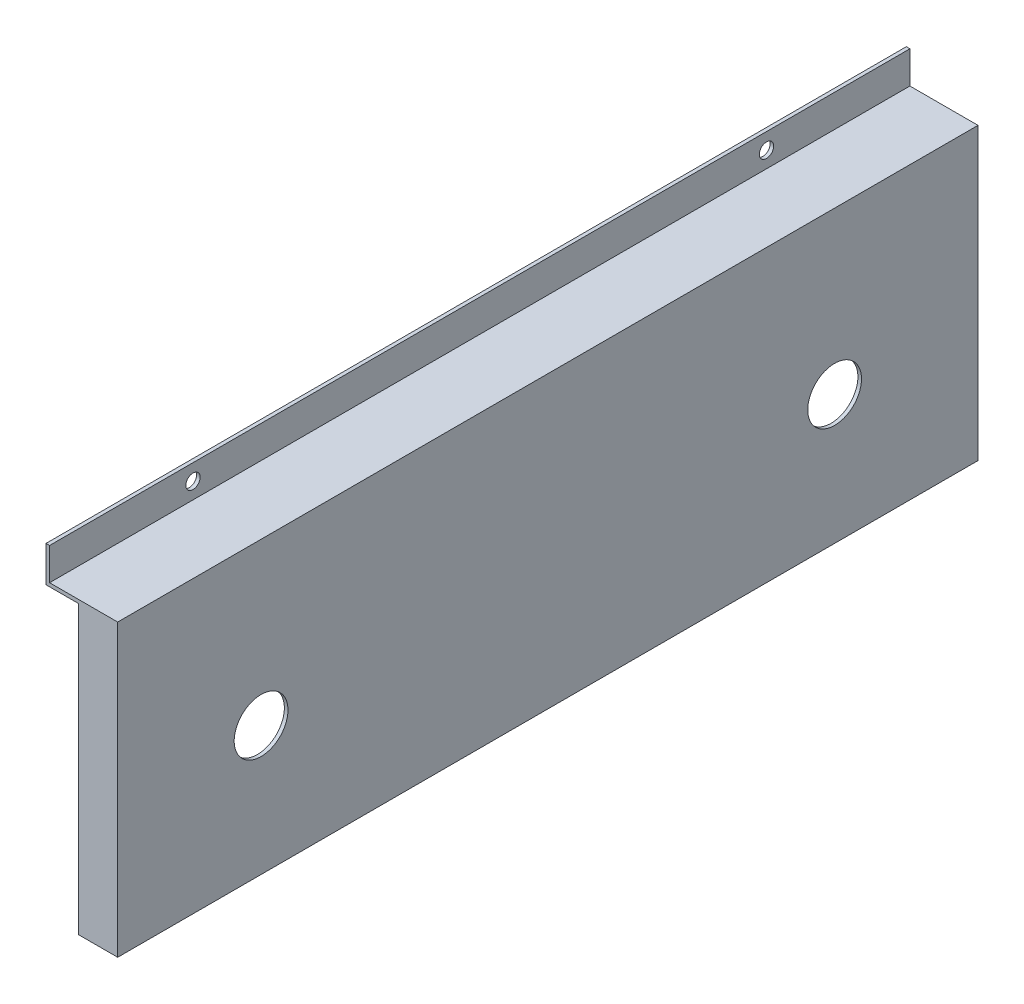
ISO-10303-21;
HEADER;
FILE_DESCRIPTION(('STEP AP214'),'2;1');
FILE_NAME('part.step','',(''),(''),'','','');
FILE_SCHEMA(('AUTOMOTIVE_DESIGN { 1 0 10303 214 1 1 1 1 }'));
ENDSEC;
DATA;
#1=APPLICATION_CONTEXT('core data for automotive mechanical design processes');
#2=APPLICATION_PROTOCOL_DEFINITION('international standard','automotive_design',2000,#1);
#3=PRODUCT_CONTEXT('',#1,'mechanical');
#4=PRODUCT('Part','Part','',(#3));
#5=PRODUCT_RELATED_PRODUCT_CATEGORY('part','',(#4));
#6=PRODUCT_DEFINITION_FORMATION('','',#4);
#7=PRODUCT_DEFINITION_CONTEXT('part definition',#1,'design');
#8=PRODUCT_DEFINITION('design','',#6,#7);
#9=PRODUCT_DEFINITION_SHAPE('','',#8);
#10=(LENGTH_UNIT() NAMED_UNIT(*) SI_UNIT(.MILLI.,.METRE.));
#11=(NAMED_UNIT(*) PLANE_ANGLE_UNIT() SI_UNIT($,.RADIAN.));
#12=(NAMED_UNIT(*) SI_UNIT($,.STERADIAN.) SOLID_ANGLE_UNIT());
#13=UNCERTAINTY_MEASURE_WITH_UNIT(LENGTH_MEASURE(1.E-05),#10,'distance_accuracy_value','');
#14=(GEOMETRIC_REPRESENTATION_CONTEXT(3) GLOBAL_UNCERTAINTY_ASSIGNED_CONTEXT((#13)) GLOBAL_UNIT_ASSIGNED_CONTEXT((#10,
#11,#12)) REPRESENTATION_CONTEXT('',''));
#15=CARTESIAN_POINT('',(0.,0.,0.));
#16=DIRECTION('',(0.,0.,1.));
#17=DIRECTION('',(1.,0.,0.));
#18=AXIS2_PLACEMENT_3D('',#15,#16,#17);
#19=CARTESIAN_POINT('',(16.3306469468303,-76.1973985270025,239.));
#20=DIRECTION('',(0.,0.,1.));
#21=DIRECTION('',(1.,0.,0.));
#22=AXIS2_PLACEMENT_3D('',#19,#20,#21);
#23=PLANE('',#22);
#24=DIRECTION('',(0.,1.,0.));
#25=VECTOR('',#24,1.);
#26=CARTESIAN_POINT('',(16.3306469468303,-76.1973985270025,239.));
#27=LINE('',#26,#25);
#28=CARTESIAN_POINT('',(16.3306469468303,-66.1973985270025,239.));
#29=VERTEX_POINT('',#28);
#30=CARTESIAN_POINT('',(16.3306469468303,13.8026014729975,239.));
#31=VERTEX_POINT('',#30);
#32=EDGE_CURVE('E208',#29,#31,#27,.T.);
#33=ORIENTED_EDGE('',*,*,#32,.F.);
#34=DIRECTION('',(-1.,0.,0.));
#35=VECTOR('',#34,1.);
#36=CARTESIAN_POINT('',(16.3306469468303,-66.1973985270025,239.));
#37=LINE('',#36,#35);
#38=CARTESIAN_POINT('',(6.33064694683027,-66.1973985270025,239.));
#39=VERTEX_POINT('',#38);
#40=EDGE_CURVE('E256',#29,#39,#37,.T.);
#41=ORIENTED_EDGE('',*,*,#40,.T.);
#42=DIRECTION('',(0.,-1.,0.));
#43=VECTOR('',#42,1.);
#44=CARTESIAN_POINT('',(6.33064694683027,13.8026014729975,239.));
#45=LINE('',#44,#43);
#46=CARTESIAN_POINT('',(6.33064694683027,13.8026014729975,239.));
#47=VERTEX_POINT('',#46);
#48=EDGE_CURVE('E167',#47,#39,#45,.T.);
#49=ORIENTED_EDGE('',*,*,#48,.F.);
#50=DIRECTION('',(-1.,0.,0.));
#51=VECTOR('',#50,1.);
#52=CARTESIAN_POINT('',(16.3306469468303,13.8026014729975,239.));
#53=LINE('',#52,#51);
#54=EDGE_CURVE('E213',#31,#47,#53,.T.);
#55=ORIENTED_EDGE('',*,*,#54,.F.);
#56=EDGE_LOOP('',(#33,#41,#49,#55));
#57=FACE_BOUND('',#56,.T.);
#58=ADVANCED_FACE('F33',(#57),#23,.F.);
#59=CARTESIAN_POINT('',(-2.66935305316973,23.8026014729975,240.));
#60=DIRECTION('',(1.,0.,0.));
#61=DIRECTION('',(0.,0.,-1.));
#62=AXIS2_PLACEMENT_3D('',#59,#60,#61);
#63=PLANE('',#62);
#64=CARTESIAN_POINT('',(-2.66935305316973,19.3026014729975,200.));
#65=DIRECTION('',(-1.,0.,0.));
#66=DIRECTION('',(0.,0.,1.));
#67=AXIS2_PLACEMENT_3D('',#64,#65,#66);
#68=CIRCLE('',#67,2.);
#69=CARTESIAN_POINT('',(-2.66935305316973,19.3026014729975,202.));
#70=VERTEX_POINT('',#69);
#71=EDGE_CURVE('E164',#70,#70,#68,.T.);
#72=ORIENTED_EDGE('',*,*,#71,.F.);
#73=EDGE_LOOP('',(#72));
#74=FACE_BOUND('',#73,.T.);
#75=CARTESIAN_POINT('',(-2.66935305316973,19.3026014729975,40.));
#76=DIRECTION('',(-1.,0.,0.));
#77=DIRECTION('',(0.,0.,1.));
#78=AXIS2_PLACEMENT_3D('',#75,#76,#77);
#79=CIRCLE('',#78,2.);
#80=CARTESIAN_POINT('',(-2.66935305316973,19.3026014729975,42.));
#81=VERTEX_POINT('',#80);
#82=EDGE_CURVE('E160',#81,#81,#79,.T.);
#83=ORIENTED_EDGE('',*,*,#82,.F.);
#84=EDGE_LOOP('',(#83));
#85=FACE_BOUND('',#84,.T.);
#86=DIRECTION('',(0.,0.,-1.));
#87=VECTOR('',#86,1.);
#88=CARTESIAN_POINT('',(-2.66935305316973,13.8026014729975,1.));
#89=LINE('',#88,#87);
#90=CARTESIAN_POINT('',(-2.66935305316973,13.8026014729975,240.));
#91=VERTEX_POINT('',#90);
#92=CARTESIAN_POINT('',(-2.66935305316973,13.8026014729975,0.));
#93=VERTEX_POINT('',#92);
#94=EDGE_CURVE('E159',#91,#93,#89,.T.);
#95=ORIENTED_EDGE('',*,*,#94,.F.);
#96=DIRECTION('',(0.,-1.,0.));
#97=VECTOR('',#96,1.);
#98=CARTESIAN_POINT('',(-2.66935305316973,23.8026014729975,240.));
#99=LINE('',#98,#97);
#100=CARTESIAN_POINT('',(-2.66935305316973,23.8026014729975,240.));
#101=VERTEX_POINT('',#100);
#102=EDGE_CURVE('E147',#101,#91,#99,.T.);
#103=ORIENTED_EDGE('',*,*,#102,.F.);
#104=DIRECTION('',(0.,0.,-1.));
#105=VECTOR('',#104,1.);
#106=CARTESIAN_POINT('',(-2.66935305316973,23.8026014729975,240.));
#107=LINE('',#106,#105);
#108=CARTESIAN_POINT('',(-2.66935305316973,23.8026014729975,0.));
#109=VERTEX_POINT('',#108);
#110=EDGE_CURVE('E41',#101,#109,#107,.T.);
#111=ORIENTED_EDGE('',*,*,#110,.T.);
#112=DIRECTION('',(0.,-1.,0.));
#113=VECTOR('',#112,1.);
#114=CARTESIAN_POINT('',(-2.66935305316973,23.8026014729975,0.));
#115=LINE('',#114,#113);
#116=EDGE_CURVE('E145',#109,#93,#115,.T.);
#117=ORIENTED_EDGE('',*,*,#116,.T.);
#118=EDGE_LOOP('',(#95,#103,#111,#117));
#119=FACE_BOUND('',#118,.T.);
#120=ADVANCED_FACE('F35',(#74,#85,#119),#63,.F.);
#121=CARTESIAN_POINT('',(17.3306469468303,23.8026014729975,240.));
#122=DIRECTION('',(-1.,0.,0.));
#123=DIRECTION('',(0.,-1.,0.));
#124=AXIS2_PLACEMENT_3D('',#121,#122,#123);
#125=PLANE('',#124);
#126=CARTESIAN_POINT('',(17.3306469468303,-30.1973985270025,40.));
#127=DIRECTION('',(1.,0.,0.));
#128=DIRECTION('',(0.,0.,-1.));
#129=AXIS2_PLACEMENT_3D('',#126,#127,#128);
#130=CIRCLE('',#129,7.5);
#131=CARTESIAN_POINT('',(17.3306469468303,-30.1973985270025,32.5));
#132=VERTEX_POINT('',#131);
#133=EDGE_CURVE('E171',#132,#132,#130,.T.);
#134=ORIENTED_EDGE('',*,*,#133,.F.);
#135=EDGE_LOOP('',(#134));
#136=FACE_BOUND('',#135,.T.);
#137=CARTESIAN_POINT('',(17.3306469468303,-30.1973985270025,200.));
#138=DIRECTION('',(1.,0.,0.));
#139=DIRECTION('',(0.,0.,-1.));
#140=AXIS2_PLACEMENT_3D('',#137,#138,#139);
#141=CIRCLE('',#140,7.50000000000001);
#142=CARTESIAN_POINT('',(17.3306469468303,-30.1973985270025,192.5));
#143=VERTEX_POINT('',#142);
#144=EDGE_CURVE('E168',#143,#143,#141,.T.);
#145=ORIENTED_EDGE('',*,*,#144,.F.);
#146=EDGE_LOOP('',(#145));
#147=FACE_BOUND('',#146,.T.);
#148=DIRECTION('',(0.,1.,0.));
#149=VECTOR('',#148,1.);
#150=CARTESIAN_POINT('',(17.3306469468303,23.8026014729975,240.));
#151=LINE('',#150,#149);
#152=CARTESIAN_POINT('',(17.3306469468303,-66.1973985270025,240.));
#153=VERTEX_POINT('',#152);
#154=CARTESIAN_POINT('',(17.3306469468303,14.8026014729975,240.));
#155=VERTEX_POINT('',#154);
#156=EDGE_CURVE('E137',#153,#155,#151,.T.);
#157=ORIENTED_EDGE('',*,*,#156,.F.);
#158=DIRECTION('',(0.,0.,1.));
#159=VECTOR('',#158,1.);
#160=CARTESIAN_POINT('',(17.3306469468303,-66.1973985270025,240.));
#161=LINE('',#160,#159);
#162=CARTESIAN_POINT('',(17.3306469468303,-66.1973985270025,0.));
#163=VERTEX_POINT('',#162);
#164=EDGE_CURVE('E123',#163,#153,#161,.T.);
#165=ORIENTED_EDGE('',*,*,#164,.F.);
#166=DIRECTION('',(0.,1.,0.));
#167=VECTOR('',#166,1.);
#168=CARTESIAN_POINT('',(17.3306469468303,23.8026014729975,0.));
#169=LINE('',#168,#167);
#170=CARTESIAN_POINT('',(17.3306469468303,14.8026014729975,0.));
#171=VERTEX_POINT('',#170);
#172=EDGE_CURVE('E135',#163,#171,#169,.T.);
#173=ORIENTED_EDGE('',*,*,#172,.T.);
#174=DIRECTION('',(0.,0.,1.));
#175=VECTOR('',#174,1.);
#176=CARTESIAN_POINT('',(17.3306469468303,14.8026014729975,-21.0237960416286));
#177=LINE('',#176,#175);
#178=EDGE_CURVE('E223',#171,#155,#177,.T.);
#179=ORIENTED_EDGE('',*,*,#178,.T.);
#180=EDGE_LOOP('',(#157,#165,#173,#179));
#181=FACE_BOUND('',#180,.T.);
#182=ADVANCED_FACE('F133',(#136,#147,#181),#125,.F.);
#183=CARTESIAN_POINT('',(-2.66935305316973,23.8026014729975,240.));
#184=DIRECTION('',(0.,-1.,0.));
#185=DIRECTION('',(0.,0.,-1.));
#186=AXIS2_PLACEMENT_3D('',#183,#184,#185);
#187=PLANE('',#186);
#188=DIRECTION('',(-1.,0.,0.));
#189=VECTOR('',#188,1.);
#190=CARTESIAN_POINT('',(-2.66935305316973,23.8026014729975,240.));
#191=LINE('',#190,#189);
#192=CARTESIAN_POINT('',(-1.66935305316975,23.8026014729975,240.));
#193=VERTEX_POINT('',#192);
#194=EDGE_CURVE('E155',#193,#101,#191,.T.);
#195=ORIENTED_EDGE('',*,*,#194,.F.);
#196=DIRECTION('',(0.,0.,1.));
#197=VECTOR('',#196,1.);
#198=CARTESIAN_POINT('',(-1.66935305316975,23.8026014729975,-21.0237960416286));
#199=LINE('',#198,#197);
#200=CARTESIAN_POINT('',(-1.66935305316975,23.8026014729975,0.));
#201=VERTEX_POINT('',#200);
#202=EDGE_CURVE('E230',#201,#193,#199,.T.);
#203=ORIENTED_EDGE('',*,*,#202,.F.);
#204=DIRECTION('',(-1.,0.,0.));
#205=VECTOR('',#204,1.);
#206=CARTESIAN_POINT('',(-2.66935305316973,23.8026014729975,0.));
#207=LINE('',#206,#205);
#208=EDGE_CURVE('E144',#201,#109,#207,.T.);
#209=ORIENTED_EDGE('',*,*,#208,.T.);
#210=ORIENTED_EDGE('',*,*,#110,.F.);
#211=EDGE_LOOP('',(#195,#203,#209,#210));
#212=FACE_BOUND('',#211,.T.);
#213=ADVANCED_FACE('F247',(#212),#187,.F.);
#214=CARTESIAN_POINT('',(0.,0.,240.));
#215=DIRECTION('',(0.,0.,1.));
#216=DIRECTION('',(1.,0.,0.));
#217=AXIS2_PLACEMENT_3D('',#214,#215,#216);
#218=PLANE('',#217);
#219=DIRECTION('',(1.,0.,0.));
#220=VECTOR('',#219,1.);
#221=CARTESIAN_POINT('',(-2.66935305316974,-66.1973985270025,240.));
#222=LINE('',#221,#220);
#223=CARTESIAN_POINT('',(6.33064694683027,-66.1973985270025,240.));
#224=VERTEX_POINT('',#223);
#225=EDGE_CURVE('E47',#224,#153,#222,.T.);
#226=ORIENTED_EDGE('',*,*,#225,.T.);
#227=ORIENTED_EDGE('',*,*,#156,.T.);
#228=DIRECTION('',(1.,0.,0.));
#229=VECTOR('',#228,1.);
#230=CARTESIAN_POINT('',(17.3306469468303,14.8026014729975,240.));
#231=LINE('',#230,#229);
#232=CARTESIAN_POINT('',(-1.66935305316974,14.8026014729975,240.));
#233=VERTEX_POINT('',#232);
#234=EDGE_CURVE('E227',#233,#155,#231,.T.);
#235=ORIENTED_EDGE('',*,*,#234,.F.);
#236=DIRECTION('',(0.,-1.,0.));
#237=VECTOR('',#236,1.);
#238=CARTESIAN_POINT('',(-1.66935305316975,23.8026014729975,240.));
#239=LINE('',#238,#237);
#240=EDGE_CURVE('E218',#193,#233,#239,.T.);
#241=ORIENTED_EDGE('',*,*,#240,.F.);
#242=ORIENTED_EDGE('',*,*,#194,.T.);
#243=ORIENTED_EDGE('',*,*,#102,.T.);
#244=DIRECTION('',(-1.,0.,0.));
#245=VECTOR('',#244,1.);
#246=CARTESIAN_POINT('',(6.33064694683027,13.8026014729975,240.));
#247=LINE('',#246,#245);
#248=CARTESIAN_POINT('',(6.33064694683027,13.8026014729975,240.));
#249=VERTEX_POINT('',#248);
#250=EDGE_CURVE('E188',#249,#91,#247,.T.);
#251=ORIENTED_EDGE('',*,*,#250,.F.);
#252=DIRECTION('',(0.,1.,0.));
#253=VECTOR('',#252,1.);
#254=CARTESIAN_POINT('',(6.33064694683027,13.8026014729975,240.));
#255=LINE('',#254,#253);
#256=EDGE_CURVE('E185',#224,#249,#255,.T.);
#257=ORIENTED_EDGE('',*,*,#256,.F.);
#258=EDGE_LOOP('',(#226,#227,#235,#241,#242,#243,#251,#257));
#259=FACE_BOUND('',#258,.T.);
#260=ADVANCED_FACE('F241',(#259),#218,.T.);
#261=CARTESIAN_POINT('',(0.,0.,0.));
#262=DIRECTION('',(0.,0.,1.));
#263=DIRECTION('',(1.,0.,0.));
#264=AXIS2_PLACEMENT_3D('',#261,#262,#263);
#265=PLANE('',#264);
#266=ORIENTED_EDGE('',*,*,#172,.F.);
#267=DIRECTION('',(1.,0.,0.));
#268=VECTOR('',#267,1.);
#269=CARTESIAN_POINT('',(-2.66935305316974,-66.1973985270025,0.));
#270=LINE('',#269,#268);
#271=CARTESIAN_POINT('',(6.33064694683027,-66.1973985270025,0.));
#272=VERTEX_POINT('',#271);
#273=EDGE_CURVE('E120',#272,#163,#270,.T.);
#274=ORIENTED_EDGE('',*,*,#273,.F.);
#275=DIRECTION('',(0.,-1.,0.));
#276=VECTOR('',#275,1.);
#277=CARTESIAN_POINT('',(6.33064694683027,13.8026014729975,0.));
#278=LINE('',#277,#276);
#279=CARTESIAN_POINT('',(6.33064694683027,13.8026014729975,0.));
#280=VERTEX_POINT('',#279);
#281=EDGE_CURVE('E196',#280,#272,#278,.T.);
#282=ORIENTED_EDGE('',*,*,#281,.F.);
#283=DIRECTION('',(-1.,0.,0.));
#284=VECTOR('',#283,1.);
#285=CARTESIAN_POINT('',(6.33064694683027,13.8026014729975,0.));
#286=LINE('',#285,#284);
#287=EDGE_CURVE('E198',#280,#93,#286,.T.);
#288=ORIENTED_EDGE('',*,*,#287,.T.);
#289=ORIENTED_EDGE('',*,*,#116,.F.);
#290=ORIENTED_EDGE('',*,*,#208,.F.);
#291=DIRECTION('',(0.,1.,0.));
#292=VECTOR('',#291,1.);
#293=CARTESIAN_POINT('',(-1.66935305316975,23.8026014729975,0.));
#294=LINE('',#293,#292);
#295=CARTESIAN_POINT('',(-1.66935305316974,14.8026014729975,0.));
#296=VERTEX_POINT('',#295);
#297=EDGE_CURVE('E221',#296,#201,#294,.T.);
#298=ORIENTED_EDGE('',*,*,#297,.F.);
#299=DIRECTION('',(-1.,0.,0.));
#300=VECTOR('',#299,1.);
#301=CARTESIAN_POINT('',(17.3306469468303,14.8026014729975,0.));
#302=LINE('',#301,#300);
#303=EDGE_CURVE('E143',#171,#296,#302,.T.);
#304=ORIENTED_EDGE('',*,*,#303,.F.);
#305=EDGE_LOOP('',(#266,#274,#282,#288,#289,#290,#298,#304));
#306=FACE_BOUND('',#305,.T.);
#307=ADVANCED_FACE('F140',(#306),#265,.F.);
#308=CARTESIAN_POINT('',(17.3306469468303,14.8026014729975,-21.0237960416286));
#309=DIRECTION('',(0.,-1.,0.));
#310=DIRECTION('',(1.,0.,0.));
#311=AXIS2_PLACEMENT_3D('',#308,#309,#310);
#312=PLANE('',#311);
#313=ORIENTED_EDGE('',*,*,#303,.T.);
#314=DIRECTION('',(0.,0.,1.));
#315=VECTOR('',#314,1.);
#316=CARTESIAN_POINT('',(-1.66935305316974,14.8026014729975,-21.0237960416286));
#317=LINE('',#316,#315);
#318=EDGE_CURVE('E232',#296,#233,#317,.T.);
#319=ORIENTED_EDGE('',*,*,#318,.T.);
#320=ORIENTED_EDGE('',*,*,#234,.T.);
#321=ORIENTED_EDGE('',*,*,#178,.F.);
#322=EDGE_LOOP('',(#313,#319,#320,#321));
#323=FACE_BOUND('',#322,.T.);
#324=ADVANCED_FACE('F279',(#323),#312,.F.);
#325=CARTESIAN_POINT('',(-1.66935305316975,23.8026014729975,-21.0237960416286));
#326=DIRECTION('',(-1.,0.,0.));
#327=DIRECTION('',(0.,-1.,0.));
#328=AXIS2_PLACEMENT_3D('',#325,#326,#327);
#329=PLANE('',#328);
#330=CARTESIAN_POINT('',(-1.66935305316974,19.3026014729975,200.));
#331=DIRECTION('',(-1.,0.,0.));
#332=DIRECTION('',(0.,-1.,0.));
#333=AXIS2_PLACEMENT_3D('',#330,#331,#332);
#334=CIRCLE('',#333,2.);
#335=CARTESIAN_POINT('',(-1.66935305316974,17.3026014729975,200.));
#336=VERTEX_POINT('',#335);
#337=EDGE_CURVE('E161',#336,#336,#334,.T.);
#338=ORIENTED_EDGE('',*,*,#337,.T.);
#339=EDGE_LOOP('',(#338));
#340=FACE_BOUND('',#339,.T.);
#341=CARTESIAN_POINT('',(-1.66935305316974,19.3026014729975,40.));
#342=DIRECTION('',(-1.,0.,0.));
#343=DIRECTION('',(0.,-1.,0.));
#344=AXIS2_PLACEMENT_3D('',#341,#342,#343);
#345=CIRCLE('',#344,2.);
#346=CARTESIAN_POINT('',(-1.66935305316974,17.3026014729975,40.));
#347=VERTEX_POINT('',#346);
#348=EDGE_CURVE('E156',#347,#347,#345,.T.);
#349=ORIENTED_EDGE('',*,*,#348,.T.);
#350=EDGE_LOOP('',(#349));
#351=FACE_BOUND('',#350,.T.);
#352=ORIENTED_EDGE('',*,*,#297,.T.);
#353=ORIENTED_EDGE('',*,*,#202,.T.);
#354=ORIENTED_EDGE('',*,*,#240,.T.);
#355=ORIENTED_EDGE('',*,*,#318,.F.);
#356=EDGE_LOOP('',(#352,#353,#354,#355));
#357=FACE_BOUND('',#356,.T.);
#358=ADVANCED_FACE('F277',(#340,#351,#357),#329,.F.);
#359=CARTESIAN_POINT('',(16.3306469468303,-76.1973985270025,1.));
#360=DIRECTION('',(0.,0.,-1.));
#361=DIRECTION('',(0.,1.,0.));
#362=AXIS2_PLACEMENT_3D('',#359,#360,#361);
#363=PLANE('',#362);
#364=DIRECTION('',(0.,1.,0.));
#365=VECTOR('',#364,1.);
#366=CARTESIAN_POINT('',(6.33064694683027,13.8026014729975,1.));
#367=LINE('',#366,#365);
#368=CARTESIAN_POINT('',(6.33064694683027,-66.1973985270025,1.));
#369=VERTEX_POINT('',#368);
#370=CARTESIAN_POINT('',(6.33064694683027,13.8026014729975,1.));
#371=VERTEX_POINT('',#370);
#372=EDGE_CURVE('E191',#369,#371,#367,.T.);
#373=ORIENTED_EDGE('',*,*,#372,.F.);
#374=DIRECTION('',(1.,0.,0.));
#375=VECTOR('',#374,1.);
#376=CARTESIAN_POINT('',(16.3306469468303,-66.1973985270025,1.));
#377=LINE('',#376,#375);
#378=CARTESIAN_POINT('',(16.3306469468303,-66.1973985270025,1.));
#379=VERTEX_POINT('',#378);
#380=EDGE_CURVE('E180',#369,#379,#377,.T.);
#381=ORIENTED_EDGE('',*,*,#380,.T.);
#382=DIRECTION('',(0.,-1.,0.));
#383=VECTOR('',#382,1.);
#384=CARTESIAN_POINT('',(16.3306469468303,-76.1973985270025,1.));
#385=LINE('',#384,#383);
#386=CARTESIAN_POINT('',(16.3306469468303,13.8026014729975,1.));
#387=VERTEX_POINT('',#386);
#388=EDGE_CURVE('E205',#387,#379,#385,.T.);
#389=ORIENTED_EDGE('',*,*,#388,.F.);
#390=DIRECTION('',(-1.,0.,0.));
#391=VECTOR('',#390,1.);
#392=CARTESIAN_POINT('',(16.3306469468303,13.8026014729975,1.));
#393=LINE('',#392,#391);
#394=EDGE_CURVE('E215',#387,#371,#393,.T.);
#395=ORIENTED_EDGE('',*,*,#394,.T.);
#396=EDGE_LOOP('',(#373,#381,#389,#395));
#397=FACE_BOUND('',#396,.T.);
#398=ADVANCED_FACE('F269',(#397),#363,.F.);
#399=CARTESIAN_POINT('',(16.3306469468303,13.8026014729975,1.));
#400=DIRECTION('',(0.,1.,0.));
#401=DIRECTION('',(0.,0.,1.));
#402=AXIS2_PLACEMENT_3D('',#399,#400,#401);
#403=PLANE('',#402);
#404=ORIENTED_EDGE('',*,*,#94,.T.);
#405=ORIENTED_EDGE('',*,*,#287,.F.);
#406=DIRECTION('',(0.,0.,-1.));
#407=VECTOR('',#406,1.);
#408=CARTESIAN_POINT('',(6.33064694683027,13.8026014729975,1.));
#409=LINE('',#408,#407);
#410=EDGE_CURVE('E193',#371,#280,#409,.T.);
#411=ORIENTED_EDGE('',*,*,#410,.F.);
#412=ORIENTED_EDGE('',*,*,#394,.F.);
#413=DIRECTION('',(0.,0.,-1.));
#414=VECTOR('',#413,1.);
#415=CARTESIAN_POINT('',(16.3306469468303,13.8026014729975,1.));
#416=LINE('',#415,#414);
#417=EDGE_CURVE('E210',#31,#387,#416,.T.);
#418=ORIENTED_EDGE('',*,*,#417,.F.);
#419=ORIENTED_EDGE('',*,*,#54,.T.);
#420=DIRECTION('',(0.,0.,-1.));
#421=VECTOR('',#420,1.);
#422=CARTESIAN_POINT('',(6.33064694683027,13.8026014729975,239.));
#423=LINE('',#422,#421);
#424=EDGE_CURVE('E55',#249,#47,#423,.T.);
#425=ORIENTED_EDGE('',*,*,#424,.F.);
#426=ORIENTED_EDGE('',*,*,#250,.T.);
#427=EDGE_LOOP('',(#404,#405,#411,#412,#418,#419,#425,#426));
#428=FACE_BOUND('',#427,.T.);
#429=ADVANCED_FACE('F252',(#428),#403,.F.);
#430=CARTESIAN_POINT('',(16.3306469468303,0.,0.));
#431=DIRECTION('',(1.,0.,0.));
#432=DIRECTION('',(0.,0.,-1.));
#433=AXIS2_PLACEMENT_3D('',#430,#431,#432);
#434=PLANE('',#433);
#435=CARTESIAN_POINT('',(16.3306469468303,-30.1973985270025,40.));
#436=DIRECTION('',(1.,0.,0.));
#437=DIRECTION('',(0.,0.,-1.));
#438=AXIS2_PLACEMENT_3D('',#435,#436,#437);
#439=CIRCLE('',#438,7.5);
#440=CARTESIAN_POINT('',(16.3306469468303,-30.1973985270025,32.5));
#441=VERTEX_POINT('',#440);
#442=EDGE_CURVE('E169',#441,#441,#439,.T.);
#443=ORIENTED_EDGE('',*,*,#442,.T.);
#444=EDGE_LOOP('',(#443));
#445=FACE_BOUND('',#444,.T.);
#446=CARTESIAN_POINT('',(16.3306469468303,-30.1973985270025,200.));
#447=DIRECTION('',(1.,0.,0.));
#448=DIRECTION('',(0.,0.,-1.));
#449=AXIS2_PLACEMENT_3D('',#446,#447,#448);
#450=CIRCLE('',#449,7.50000000000001);
#451=CARTESIAN_POINT('',(16.3306469468303,-30.1973985270025,192.5));
#452=VERTEX_POINT('',#451);
#453=EDGE_CURVE('E165',#452,#452,#450,.T.);
#454=ORIENTED_EDGE('',*,*,#453,.T.);
#455=EDGE_LOOP('',(#454));
#456=FACE_BOUND('',#455,.T.);
#457=ORIENTED_EDGE('',*,*,#388,.T.);
#458=DIRECTION('',(0.,0.,1.));
#459=VECTOR('',#458,1.);
#460=CARTESIAN_POINT('',(16.3306469468303,-66.1973985270025,0.));
#461=LINE('',#460,#459);
#462=EDGE_CURVE('E261',#379,#29,#461,.T.);
#463=ORIENTED_EDGE('',*,*,#462,.T.);
#464=ORIENTED_EDGE('',*,*,#32,.T.);
#465=ORIENTED_EDGE('',*,*,#417,.T.);
#466=EDGE_LOOP('',(#457,#463,#464,#465));
#467=FACE_BOUND('',#466,.T.);
#468=ADVANCED_FACE('F271',(#445,#456,#467),#434,.F.);
#469=CARTESIAN_POINT('',(16.3306469468303,19.3026014729975,40.));
#470=DIRECTION('',(-1.,0.,0.));
#471=DIRECTION('',(0.,0.,1.));
#472=AXIS2_PLACEMENT_3D('',#469,#470,#471);
#473=CYLINDRICAL_SURFACE('',#472,2.);
#474=ORIENTED_EDGE('',*,*,#82,.T.);
#475=EDGE_LOOP('',(#474));
#476=FACE_BOUND('',#475,.T.);
#477=ORIENTED_EDGE('',*,*,#348,.F.);
#478=EDGE_LOOP('',(#477));
#479=FACE_BOUND('',#478,.T.);
#480=ADVANCED_FACE('F305',(#476,#479),#473,.F.);
#481=CARTESIAN_POINT('',(16.3306469468303,19.3026014729975,200.));
#482=DIRECTION('',(-1.,0.,0.));
#483=DIRECTION('',(0.,0.,1.));
#484=AXIS2_PLACEMENT_3D('',#481,#482,#483);
#485=CYLINDRICAL_SURFACE('',#484,2.);
#486=ORIENTED_EDGE('',*,*,#71,.T.);
#487=EDGE_LOOP('',(#486));
#488=FACE_BOUND('',#487,.T.);
#489=ORIENTED_EDGE('',*,*,#337,.F.);
#490=EDGE_LOOP('',(#489));
#491=FACE_BOUND('',#490,.T.);
#492=ADVANCED_FACE('F309',(#488,#491),#485,.F.);
#493=CARTESIAN_POINT('',(6.33064694683027,0.,0.));
#494=DIRECTION('',(1.,0.,0.));
#495=DIRECTION('',(0.,0.,-1.));
#496=AXIS2_PLACEMENT_3D('',#493,#494,#495);
#497=PLANE('',#496);
#498=ORIENTED_EDGE('',*,*,#281,.T.);
#499=DIRECTION('',(0.,0.,1.));
#500=VECTOR('',#499,1.);
#501=CARTESIAN_POINT('',(6.33064694683027,-66.1973985270025,0.));
#502=LINE('',#501,#500);
#503=EDGE_CURVE('E125',#272,#369,#502,.T.);
#504=ORIENTED_EDGE('',*,*,#503,.T.);
#505=ORIENTED_EDGE('',*,*,#372,.T.);
#506=ORIENTED_EDGE('',*,*,#410,.T.);
#507=EDGE_LOOP('',(#498,#504,#505,#506));
#508=FACE_BOUND('',#507,.T.);
#509=ADVANCED_FACE('F275',(#508),#497,.F.);
#510=CARTESIAN_POINT('',(6.33064694683027,0.,0.));
#511=DIRECTION('',(-1.,0.,0.));
#512=DIRECTION('',(0.,0.,1.));
#513=AXIS2_PLACEMENT_3D('',#510,#511,#512);
#514=PLANE('',#513);
#515=DIRECTION('',(0.,0.,-1.));
#516=VECTOR('',#515,1.);
#517=CARTESIAN_POINT('',(6.33064694683027,-66.1973985270025,0.));
#518=LINE('',#517,#516);
#519=EDGE_CURVE('E11',#224,#39,#518,.T.);
#520=ORIENTED_EDGE('',*,*,#519,.F.);
#521=ORIENTED_EDGE('',*,*,#256,.T.);
#522=ORIENTED_EDGE('',*,*,#424,.T.);
#523=ORIENTED_EDGE('',*,*,#48,.T.);
#524=EDGE_LOOP('',(#520,#521,#522,#523));
#525=FACE_BOUND('',#524,.T.);
#526=ADVANCED_FACE('F254',(#525),#514,.T.);
#527=CARTESIAN_POINT('',(-2.66935305316974,-30.1973985270025,200.));
#528=DIRECTION('',(1.,0.,0.));
#529=DIRECTION('',(0.,0.,-1.));
#530=AXIS2_PLACEMENT_3D('',#527,#528,#529);
#531=CYLINDRICAL_SURFACE('',#530,7.50000000000001);
#532=ORIENTED_EDGE('',*,*,#144,.T.);
#533=EDGE_LOOP('',(#532));
#534=FACE_BOUND('',#533,.T.);
#535=ORIENTED_EDGE('',*,*,#453,.F.);
#536=EDGE_LOOP('',(#535));
#537=FACE_BOUND('',#536,.T.);
#538=ADVANCED_FACE('F321',(#534,#537),#531,.F.);
#539=CARTESIAN_POINT('',(-2.66935305316974,-30.1973985270025,40.));
#540=DIRECTION('',(1.,0.,0.));
#541=DIRECTION('',(0.,0.,-1.));
#542=AXIS2_PLACEMENT_3D('',#539,#540,#541);
#543=CYLINDRICAL_SURFACE('',#542,7.5);
#544=ORIENTED_EDGE('',*,*,#133,.T.);
#545=EDGE_LOOP('',(#544));
#546=FACE_BOUND('',#545,.T.);
#547=ORIENTED_EDGE('',*,*,#442,.F.);
#548=EDGE_LOOP('',(#547));
#549=FACE_BOUND('',#548,.T.);
#550=ADVANCED_FACE('F324',(#546,#549),#543,.F.);
#551=CARTESIAN_POINT('',(-2.66935305316974,-66.1973985270025,240.));
#552=DIRECTION('',(0.,1.,0.));
#553=DIRECTION('',(0.,0.,1.));
#554=AXIS2_PLACEMENT_3D('',#551,#552,#553);
#555=PLANE('',#554);
#556=ORIENTED_EDGE('',*,*,#273,.T.);
#557=ORIENTED_EDGE('',*,*,#164,.T.);
#558=ORIENTED_EDGE('',*,*,#225,.F.);
#559=ORIENTED_EDGE('',*,*,#519,.T.);
#560=ORIENTED_EDGE('',*,*,#40,.F.);
#561=ORIENTED_EDGE('',*,*,#462,.F.);
#562=ORIENTED_EDGE('',*,*,#380,.F.);
#563=ORIENTED_EDGE('',*,*,#503,.F.);
#564=EDGE_LOOP('',(#556,#557,#558,#559,#560,#561,#562,#563));
#565=FACE_BOUND('',#564,.T.);
#566=ADVANCED_FACE('F122',(#565),#555,.F.);
#567=CLOSED_SHELL('',(#58,#120,#182,#213,#260,#307,#324,#358,#398,#429,#468,#480,#492,#509,#526,
#538,#550,#566));
#568=MANIFOLD_SOLID_BREP('B2',#567);
#569=ADVANCED_BREP_SHAPE_REPRESENTATION('',(#18,#568),#14);
#570=SHAPE_DEFINITION_REPRESENTATION(#9,#569);
ENDSEC;
END-ISO-10303-21;
